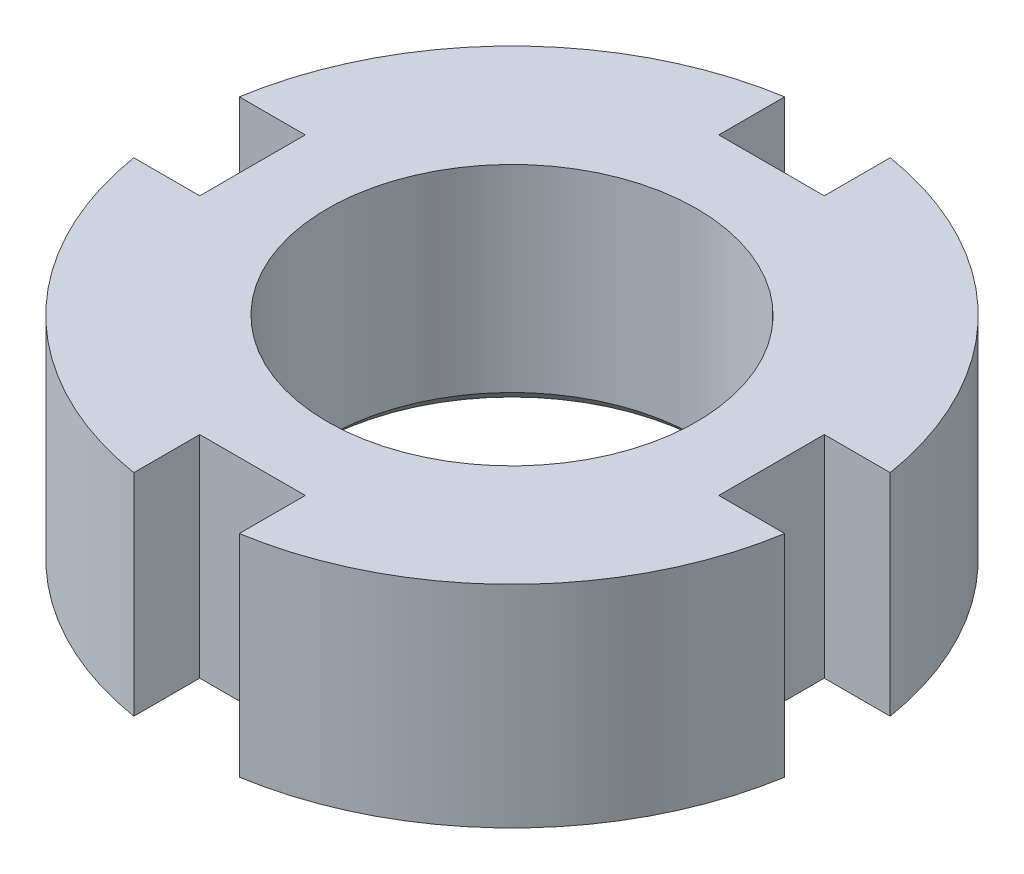
ISO-10303-21;
HEADER;
FILE_DESCRIPTION(('STEP AP214'),'2;1');
FILE_NAME('part.step','',(''),(''),'','','');
FILE_SCHEMA(('AUTOMOTIVE_DESIGN { 1 0 10303 214 1 1 1 1 }'));
ENDSEC;
DATA;
#1=APPLICATION_CONTEXT('core data for automotive mechanical design processes');
#2=APPLICATION_PROTOCOL_DEFINITION('international standard','automotive_design',2000,#1);
#3=PRODUCT_CONTEXT('',#1,'mechanical');
#4=PRODUCT('Part','Part','',(#3));
#5=PRODUCT_RELATED_PRODUCT_CATEGORY('part','',(#4));
#6=PRODUCT_DEFINITION_FORMATION('','',#4);
#7=PRODUCT_DEFINITION_CONTEXT('part definition',#1,'design');
#8=PRODUCT_DEFINITION('design','',#6,#7);
#9=PRODUCT_DEFINITION_SHAPE('','',#8);
#10=(LENGTH_UNIT() NAMED_UNIT(*) SI_UNIT(.MILLI.,.METRE.));
#11=(NAMED_UNIT(*) PLANE_ANGLE_UNIT() SI_UNIT($,.RADIAN.));
#12=(NAMED_UNIT(*) SI_UNIT($,.STERADIAN.) SOLID_ANGLE_UNIT());
#13=UNCERTAINTY_MEASURE_WITH_UNIT(LENGTH_MEASURE(1.E-05),#10,'distance_accuracy_value','');
#14=(GEOMETRIC_REPRESENTATION_CONTEXT(3) GLOBAL_UNCERTAINTY_ASSIGNED_CONTEXT((#13)) GLOBAL_UNIT_ASSIGNED_CONTEXT((#10,
#11,#12)) REPRESENTATION_CONTEXT('',''));
#15=CARTESIAN_POINT('',(0.,0.,0.));
#16=DIRECTION('',(0.,0.,1.));
#17=DIRECTION('',(1.,0.,0.));
#18=AXIS2_PLACEMENT_3D('',#15,#16,#17);
#19=CARTESIAN_POINT('',(19.6779253585061,8.,-4.));
#20=DIRECTION('',(-1.,0.,0.));
#21=DIRECTION('',(0.,0.,1.));
#22=AXIS2_PLACEMENT_3D('',#19,#20,#21);
#23=PLANE('',#22);
#24=DIRECTION('',(0.,0.,-1.));
#25=VECTOR('',#24,1.);
#26=CARTESIAN_POINT('',(19.6779253585061,-8.,-4.));
#27=LINE('',#26,#25);
#28=CARTESIAN_POINT('',(19.6779253585061,-8.,4.));
#29=VERTEX_POINT('',#28);
#30=CARTESIAN_POINT('',(19.6779253585061,-8.,-4.));
#31=VERTEX_POINT('',#30);
#32=EDGE_CURVE('E200',#29,#31,#27,.T.);
#33=ORIENTED_EDGE('',*,*,#32,.T.);
#34=DIRECTION('',(0.,-1.,0.));
#35=VECTOR('',#34,1.);
#36=CARTESIAN_POINT('',(19.6779253585061,8.,-4.));
#37=LINE('',#36,#35);
#38=CARTESIAN_POINT('',(19.6779253585061,8.,-4.));
#39=VERTEX_POINT('',#38);
#40=EDGE_CURVE('E11',#39,#31,#37,.T.);
#41=ORIENTED_EDGE('',*,*,#40,.F.);
#42=DIRECTION('',(0.,0.,-1.));
#43=VECTOR('',#42,1.);
#44=CARTESIAN_POINT('',(19.6779253585061,8.,-4.));
#45=LINE('',#44,#43);
#46=CARTESIAN_POINT('',(19.6779253585061,8.,4.));
#47=VERTEX_POINT('',#46);
#48=EDGE_CURVE('E247',#47,#39,#45,.T.);
#49=ORIENTED_EDGE('',*,*,#48,.F.);
#50=DIRECTION('',(0.,-1.,0.));
#51=VECTOR('',#50,1.);
#52=CARTESIAN_POINT('',(19.6779253585061,8.,4.));
#53=LINE('',#52,#51);
#54=EDGE_CURVE('E196',#47,#29,#53,.T.);
#55=ORIENTED_EDGE('',*,*,#54,.T.);
#56=EDGE_LOOP('',(#33,#41,#49,#55));
#57=FACE_BOUND('',#56,.T.);
#58=ADVANCED_FACE('F51',(#57),#23,.F.);
#59=CARTESIAN_POINT('',(19.6779253585061,8.,-4.));
#60=DIRECTION('',(0.,0.,-1.));
#61=DIRECTION('',(-1.,0.,0.));
#62=AXIS2_PLACEMENT_3D('',#59,#60,#61);
#63=PLANE('',#62);
#64=DIRECTION('',(1.,0.,0.));
#65=VECTOR('',#64,1.);
#66=CARTESIAN_POINT('',(19.6779253585061,-8.,-4.));
#67=LINE('',#66,#65);
#68=CARTESIAN_POINT('',(24.6779253585061,-8.,-4.));
#69=VERTEX_POINT('',#68);
#70=EDGE_CURVE('E204',#31,#69,#67,.T.);
#71=ORIENTED_EDGE('',*,*,#70,.T.);
#72=DIRECTION('',(0.,-1.,0.));
#73=VECTOR('',#72,1.);
#74=CARTESIAN_POINT('',(24.6779253585061,8.,-4.));
#75=LINE('',#74,#73);
#76=CARTESIAN_POINT('',(24.6779253585061,8.,-4.));
#77=VERTEX_POINT('',#76);
#78=EDGE_CURVE('E60',#77,#69,#75,.T.);
#79=ORIENTED_EDGE('',*,*,#78,.F.);
#80=DIRECTION('',(1.,0.,0.));
#81=VECTOR('',#80,1.);
#82=CARTESIAN_POINT('',(19.6779253585061,8.,-4.));
#83=LINE('',#82,#81);
#84=EDGE_CURVE('E135',#39,#77,#83,.T.);
#85=ORIENTED_EDGE('',*,*,#84,.F.);
#86=ORIENTED_EDGE('',*,*,#40,.T.);
#87=EDGE_LOOP('',(#71,#79,#85,#86));
#88=FACE_BOUND('',#87,.T.);
#89=ADVANCED_FACE('F370',(#88),#63,.F.);
#90=CARTESIAN_POINT('',(0.,8.,0.));
#91=DIRECTION('',(0.,-1.,0.));
#92=DIRECTION('',(0.,0.,-1.));
#93=AXIS2_PLACEMENT_3D('',#90,#91,#92);
#94=CYLINDRICAL_SURFACE('',#93,25.);
#95=CARTESIAN_POINT('',(0.,-8.,0.));
#96=DIRECTION('',(0.,1.,0.));
#97=DIRECTION('',(0.,0.,1.));
#98=AXIS2_PLACEMENT_3D('',#95,#96,#97);
#99=CIRCLE('',#98,25.);
#100=CARTESIAN_POINT('',(3.99999999999999,-8.,-24.6779253585061));
#101=VERTEX_POINT('',#100);
#102=EDGE_CURVE('E208',#69,#101,#99,.T.);
#103=ORIENTED_EDGE('',*,*,#102,.T.);
#104=DIRECTION('',(0.,-1.,0.));
#105=VECTOR('',#104,1.);
#106=CARTESIAN_POINT('',(3.99999999999999,8.,-24.6779253585061));
#107=LINE('',#106,#105);
#108=CARTESIAN_POINT('',(3.99999999999999,8.,-24.6779253585061));
#109=VERTEX_POINT('',#108);
#110=EDGE_CURVE('E290',#109,#101,#107,.T.);
#111=ORIENTED_EDGE('',*,*,#110,.F.);
#112=CARTESIAN_POINT('',(0.,8.,0.));
#113=DIRECTION('',(0.,1.,0.));
#114=DIRECTION('',(0.,0.,1.));
#115=AXIS2_PLACEMENT_3D('',#112,#113,#114);
#116=CIRCLE('',#115,25.);
#117=EDGE_CURVE('E300',#77,#109,#116,.T.);
#118=ORIENTED_EDGE('',*,*,#117,.F.);
#119=ORIENTED_EDGE('',*,*,#78,.T.);
#120=EDGE_LOOP('',(#103,#111,#118,#119));
#121=FACE_BOUND('',#120,.T.);
#122=ADVANCED_FACE('F298',(#121),#94,.T.);
#123=CARTESIAN_POINT('',(4.,8.,-19.6779253585061));
#124=DIRECTION('',(1.,0.,0.));
#125=DIRECTION('',(0.,0.,-1.));
#126=AXIS2_PLACEMENT_3D('',#123,#124,#125);
#127=PLANE('',#126);
#128=DIRECTION('',(0.,0.,1.));
#129=VECTOR('',#128,1.);
#130=CARTESIAN_POINT('',(4.,-8.,-19.6779253585061));
#131=LINE('',#130,#129);
#132=CARTESIAN_POINT('',(4.,-8.,-19.6779253585061));
#133=VERTEX_POINT('',#132);
#134=EDGE_CURVE('E211',#101,#133,#131,.T.);
#135=ORIENTED_EDGE('',*,*,#134,.T.);
#136=DIRECTION('',(0.,-1.,0.));
#137=VECTOR('',#136,1.);
#138=CARTESIAN_POINT('',(4.,8.,-19.6779253585061));
#139=LINE('',#138,#137);
#140=CARTESIAN_POINT('',(4.,8.,-19.6779253585061));
#141=VERTEX_POINT('',#140);
#142=EDGE_CURVE('E286',#141,#133,#139,.T.);
#143=ORIENTED_EDGE('',*,*,#142,.F.);
#144=DIRECTION('',(0.,0.,1.));
#145=VECTOR('',#144,1.);
#146=CARTESIAN_POINT('',(4.,8.,-19.6779253585061));
#147=LINE('',#146,#145);
#148=EDGE_CURVE('E319',#109,#141,#147,.T.);
#149=ORIENTED_EDGE('',*,*,#148,.F.);
#150=ORIENTED_EDGE('',*,*,#110,.T.);
#151=EDGE_LOOP('',(#135,#143,#149,#150));
#152=FACE_BOUND('',#151,.T.);
#153=ADVANCED_FACE('F309',(#152),#127,.F.);
#154=CARTESIAN_POINT('',(-4.,8.,-19.6779253585061));
#155=DIRECTION('',(0.,0.,1.));
#156=DIRECTION('',(1.,0.,0.));
#157=AXIS2_PLACEMENT_3D('',#154,#155,#156);
#158=PLANE('',#157);
#159=DIRECTION('',(-1.,0.,0.));
#160=VECTOR('',#159,1.);
#161=CARTESIAN_POINT('',(-4.,-8.,-19.6779253585061));
#162=LINE('',#161,#160);
#163=CARTESIAN_POINT('',(-4.,-8.,-19.6779253585061));
#164=VERTEX_POINT('',#163);
#165=EDGE_CURVE('E214',#133,#164,#162,.T.);
#166=ORIENTED_EDGE('',*,*,#165,.T.);
#167=DIRECTION('',(0.,-1.,0.));
#168=VECTOR('',#167,1.);
#169=CARTESIAN_POINT('',(-4.,8.,-19.6779253585061));
#170=LINE('',#169,#168);
#171=CARTESIAN_POINT('',(-4.,8.,-19.6779253585061));
#172=VERTEX_POINT('',#171);
#173=EDGE_CURVE('E282',#172,#164,#170,.T.);
#174=ORIENTED_EDGE('',*,*,#173,.F.);
#175=DIRECTION('',(-1.,0.,0.));
#176=VECTOR('',#175,1.);
#177=CARTESIAN_POINT('',(-4.,8.,-19.6779253585061));
#178=LINE('',#177,#176);
#179=EDGE_CURVE('E315',#141,#172,#178,.T.);
#180=ORIENTED_EDGE('',*,*,#179,.F.);
#181=ORIENTED_EDGE('',*,*,#142,.T.);
#182=EDGE_LOOP('',(#166,#174,#180,#181));
#183=FACE_BOUND('',#182,.T.);
#184=ADVANCED_FACE('F313',(#183),#158,.F.);
#185=CARTESIAN_POINT('',(-4.,8.,-19.6779253585061));
#186=DIRECTION('',(-1.,0.,0.));
#187=DIRECTION('',(0.,0.,1.));
#188=AXIS2_PLACEMENT_3D('',#185,#186,#187);
#189=PLANE('',#188);
#190=DIRECTION('',(0.,0.,-1.));
#191=VECTOR('',#190,1.);
#192=CARTESIAN_POINT('',(-4.,-8.,-19.6779253585061));
#193=LINE('',#192,#191);
#194=CARTESIAN_POINT('',(-4.,-8.,-24.6779253585061));
#195=VERTEX_POINT('',#194);
#196=EDGE_CURVE('E217',#164,#195,#193,.T.);
#197=ORIENTED_EDGE('',*,*,#196,.T.);
#198=DIRECTION('',(0.,-1.,0.));
#199=VECTOR('',#198,1.);
#200=CARTESIAN_POINT('',(-4.,8.,-24.6779253585061));
#201=LINE('',#200,#199);
#202=CARTESIAN_POINT('',(-4.,8.,-24.6779253585061));
#203=VERTEX_POINT('',#202);
#204=EDGE_CURVE('E278',#203,#195,#201,.T.);
#205=ORIENTED_EDGE('',*,*,#204,.F.);
#206=DIRECTION('',(0.,0.,-1.));
#207=VECTOR('',#206,1.);
#208=CARTESIAN_POINT('',(-4.,8.,-19.6779253585061));
#209=LINE('',#208,#207);
#210=EDGE_CURVE('E318',#172,#203,#209,.T.);
#211=ORIENTED_EDGE('',*,*,#210,.F.);
#212=ORIENTED_EDGE('',*,*,#173,.T.);
#213=EDGE_LOOP('',(#197,#205,#211,#212));
#214=FACE_BOUND('',#213,.T.);
#215=ADVANCED_FACE('F383',(#214),#189,.F.);
#216=CARTESIAN_POINT('',(0.,8.,0.));
#217=DIRECTION('',(0.,-1.,0.));
#218=DIRECTION('',(0.,0.,-1.));
#219=AXIS2_PLACEMENT_3D('',#216,#217,#218);
#220=CYLINDRICAL_SURFACE('',#219,25.);
#221=CARTESIAN_POINT('',(0.,-8.,0.));
#222=DIRECTION('',(0.,1.,0.));
#223=DIRECTION('',(0.,0.,1.));
#224=AXIS2_PLACEMENT_3D('',#221,#222,#223);
#225=CIRCLE('',#224,25.);
#226=CARTESIAN_POINT('',(-24.6779253585061,-8.,-3.99999999999999));
#227=VERTEX_POINT('',#226);
#228=EDGE_CURVE('E220',#195,#227,#225,.T.);
#229=ORIENTED_EDGE('',*,*,#228,.T.);
#230=DIRECTION('',(0.,-1.,0.));
#231=VECTOR('',#230,1.);
#232=CARTESIAN_POINT('',(-24.6779253585061,8.,-3.99999999999999));
#233=LINE('',#232,#231);
#234=CARTESIAN_POINT('',(-24.6779253585061,8.,-3.99999999999999));
#235=VERTEX_POINT('',#234);
#236=EDGE_CURVE('E274',#235,#227,#233,.T.);
#237=ORIENTED_EDGE('',*,*,#236,.F.);
#238=CARTESIAN_POINT('',(0.,8.,0.));
#239=DIRECTION('',(0.,1.,0.));
#240=DIRECTION('',(0.,0.,1.));
#241=AXIS2_PLACEMENT_3D('',#238,#239,#240);
#242=CIRCLE('',#241,25.);
#243=EDGE_CURVE('E323',#203,#235,#242,.T.);
#244=ORIENTED_EDGE('',*,*,#243,.F.);
#245=ORIENTED_EDGE('',*,*,#204,.T.);
#246=EDGE_LOOP('',(#229,#237,#244,#245));
#247=FACE_BOUND('',#246,.T.);
#248=ADVANCED_FACE('F386',(#247),#220,.T.);
#249=CARTESIAN_POINT('',(-19.6779253585061,8.,-4.));
#250=DIRECTION('',(0.,0.,-1.));
#251=DIRECTION('',(-1.,0.,0.));
#252=AXIS2_PLACEMENT_3D('',#249,#250,#251);
#253=PLANE('',#252);
#254=DIRECTION('',(1.,0.,0.));
#255=VECTOR('',#254,1.);
#256=CARTESIAN_POINT('',(-19.6779253585061,-8.,-4.));
#257=LINE('',#256,#255);
#258=CARTESIAN_POINT('',(-19.6779253585061,-8.,-4.));
#259=VERTEX_POINT('',#258);
#260=EDGE_CURVE('E223',#227,#259,#257,.T.);
#261=ORIENTED_EDGE('',*,*,#260,.T.);
#262=DIRECTION('',(0.,-1.,0.));
#263=VECTOR('',#262,1.);
#264=CARTESIAN_POINT('',(-19.6779253585061,8.,-4.));
#265=LINE('',#264,#263);
#266=CARTESIAN_POINT('',(-19.6779253585061,8.,-4.));
#267=VERTEX_POINT('',#266);
#268=EDGE_CURVE('E270',#267,#259,#265,.T.);
#269=ORIENTED_EDGE('',*,*,#268,.F.);
#270=DIRECTION('',(1.,0.,0.));
#271=VECTOR('',#270,1.);
#272=CARTESIAN_POINT('',(-19.6779253585061,8.,-4.));
#273=LINE('',#272,#271);
#274=EDGE_CURVE('E330',#235,#267,#273,.T.);
#275=ORIENTED_EDGE('',*,*,#274,.F.);
#276=ORIENTED_EDGE('',*,*,#236,.T.);
#277=EDGE_LOOP('',(#261,#269,#275,#276));
#278=FACE_BOUND('',#277,.T.);
#279=ADVANCED_FACE('F390',(#278),#253,.F.);
#280=CARTESIAN_POINT('',(-19.6779253585061,8.,4.));
#281=DIRECTION('',(1.,0.,0.));
#282=DIRECTION('',(0.,0.,-1.));
#283=AXIS2_PLACEMENT_3D('',#280,#281,#282);
#284=PLANE('',#283);
#285=DIRECTION('',(0.,0.,1.));
#286=VECTOR('',#285,1.);
#287=CARTESIAN_POINT('',(-19.6779253585061,-8.,4.));
#288=LINE('',#287,#286);
#289=CARTESIAN_POINT('',(-19.6779253585061,-8.,4.));
#290=VERTEX_POINT('',#289);
#291=EDGE_CURVE('E226',#259,#290,#288,.T.);
#292=ORIENTED_EDGE('',*,*,#291,.T.);
#293=DIRECTION('',(0.,-1.,0.));
#294=VECTOR('',#293,1.);
#295=CARTESIAN_POINT('',(-19.6779253585061,8.,4.));
#296=LINE('',#295,#294);
#297=CARTESIAN_POINT('',(-19.6779253585061,8.,4.));
#298=VERTEX_POINT('',#297);
#299=EDGE_CURVE('E266',#298,#290,#296,.T.);
#300=ORIENTED_EDGE('',*,*,#299,.F.);
#301=DIRECTION('',(0.,0.,1.));
#302=VECTOR('',#301,1.);
#303=CARTESIAN_POINT('',(-19.6779253585061,8.,4.));
#304=LINE('',#303,#302);
#305=EDGE_CURVE('E333',#267,#298,#304,.T.);
#306=ORIENTED_EDGE('',*,*,#305,.F.);
#307=ORIENTED_EDGE('',*,*,#268,.T.);
#308=EDGE_LOOP('',(#292,#300,#306,#307));
#309=FACE_BOUND('',#308,.T.);
#310=ADVANCED_FACE('F394',(#309),#284,.F.);
#311=CARTESIAN_POINT('',(-19.6779253585061,8.,4.));
#312=DIRECTION('',(0.,0.,1.));
#313=DIRECTION('',(1.,0.,0.));
#314=AXIS2_PLACEMENT_3D('',#311,#312,#313);
#315=PLANE('',#314);
#316=DIRECTION('',(-1.,0.,0.));
#317=VECTOR('',#316,1.);
#318=CARTESIAN_POINT('',(-19.6779253585061,-8.,4.));
#319=LINE('',#318,#317);
#320=CARTESIAN_POINT('',(-24.6779253585061,-8.,4.));
#321=VERTEX_POINT('',#320);
#322=EDGE_CURVE('E229',#290,#321,#319,.T.);
#323=ORIENTED_EDGE('',*,*,#322,.T.);
#324=DIRECTION('',(0.,-1.,0.));
#325=VECTOR('',#324,1.);
#326=CARTESIAN_POINT('',(-24.6779253585061,8.,4.));
#327=LINE('',#326,#325);
#328=CARTESIAN_POINT('',(-24.6779253585061,8.,4.));
#329=VERTEX_POINT('',#328);
#330=EDGE_CURVE('E262',#329,#321,#327,.T.);
#331=ORIENTED_EDGE('',*,*,#330,.F.);
#332=DIRECTION('',(-1.,0.,0.));
#333=VECTOR('',#332,1.);
#334=CARTESIAN_POINT('',(-19.6779253585061,8.,4.));
#335=LINE('',#334,#333);
#336=EDGE_CURVE('E336',#298,#329,#335,.T.);
#337=ORIENTED_EDGE('',*,*,#336,.F.);
#338=ORIENTED_EDGE('',*,*,#299,.T.);
#339=EDGE_LOOP('',(#323,#331,#337,#338));
#340=FACE_BOUND('',#339,.T.);
#341=ADVANCED_FACE('F398',(#340),#315,.F.);
#342=CARTESIAN_POINT('',(0.,8.,0.));
#343=DIRECTION('',(0.,-1.,0.));
#344=DIRECTION('',(0.,0.,-1.));
#345=AXIS2_PLACEMENT_3D('',#342,#343,#344);
#346=CYLINDRICAL_SURFACE('',#345,25.);
#347=CARTESIAN_POINT('',(0.,-8.,0.));
#348=DIRECTION('',(0.,1.,0.));
#349=DIRECTION('',(0.,0.,1.));
#350=AXIS2_PLACEMENT_3D('',#347,#348,#349);
#351=CIRCLE('',#350,25.);
#352=CARTESIAN_POINT('',(-3.99999999999999,-8.,24.6779253585061));
#353=VERTEX_POINT('',#352);
#354=EDGE_CURVE('E232',#321,#353,#351,.T.);
#355=ORIENTED_EDGE('',*,*,#354,.T.);
#356=DIRECTION('',(0.,-1.,0.));
#357=VECTOR('',#356,1.);
#358=CARTESIAN_POINT('',(-3.99999999999999,8.,24.6779253585061));
#359=LINE('',#358,#357);
#360=CARTESIAN_POINT('',(-3.99999999999999,8.,24.6779253585061));
#361=VERTEX_POINT('',#360);
#362=EDGE_CURVE('E258',#361,#353,#359,.T.);
#363=ORIENTED_EDGE('',*,*,#362,.F.);
#364=CARTESIAN_POINT('',(0.,8.,0.));
#365=DIRECTION('',(0.,1.,0.));
#366=DIRECTION('',(0.,0.,1.));
#367=AXIS2_PLACEMENT_3D('',#364,#365,#366);
#368=CIRCLE('',#367,25.);
#369=EDGE_CURVE('E339',#329,#361,#368,.T.);
#370=ORIENTED_EDGE('',*,*,#369,.F.);
#371=ORIENTED_EDGE('',*,*,#330,.T.);
#372=EDGE_LOOP('',(#355,#363,#370,#371));
#373=FACE_BOUND('',#372,.T.);
#374=ADVANCED_FACE('F402',(#373),#346,.T.);
#375=CARTESIAN_POINT('',(-4.,8.,19.6779253585061));
#376=DIRECTION('',(-1.,0.,0.));
#377=DIRECTION('',(0.,0.,1.));
#378=AXIS2_PLACEMENT_3D('',#375,#376,#377);
#379=PLANE('',#378);
#380=DIRECTION('',(0.,0.,-1.));
#381=VECTOR('',#380,1.);
#382=CARTESIAN_POINT('',(-4.,-8.,19.6779253585061));
#383=LINE('',#382,#381);
#384=CARTESIAN_POINT('',(-4.,-8.,19.6779253585061));
#385=VERTEX_POINT('',#384);
#386=EDGE_CURVE('E235',#353,#385,#383,.T.);
#387=ORIENTED_EDGE('',*,*,#386,.T.);
#388=DIRECTION('',(0.,-1.,0.));
#389=VECTOR('',#388,1.);
#390=CARTESIAN_POINT('',(-4.,8.,19.6779253585061));
#391=LINE('',#390,#389);
#392=CARTESIAN_POINT('',(-4.,8.,19.6779253585061));
#393=VERTEX_POINT('',#392);
#394=EDGE_CURVE('E254',#393,#385,#391,.T.);
#395=ORIENTED_EDGE('',*,*,#394,.F.);
#396=DIRECTION('',(0.,0.,-1.));
#397=VECTOR('',#396,1.);
#398=CARTESIAN_POINT('',(-4.,8.,19.6779253585061));
#399=LINE('',#398,#397);
#400=EDGE_CURVE('E342',#361,#393,#399,.T.);
#401=ORIENTED_EDGE('',*,*,#400,.F.);
#402=ORIENTED_EDGE('',*,*,#362,.T.);
#403=EDGE_LOOP('',(#387,#395,#401,#402));
#404=FACE_BOUND('',#403,.T.);
#405=ADVANCED_FACE('F350',(#404),#379,.F.);
#406=CARTESIAN_POINT('',(4.,8.,19.6779253585061));
#407=DIRECTION('',(0.,0.,-1.));
#408=DIRECTION('',(-1.,0.,0.));
#409=AXIS2_PLACEMENT_3D('',#406,#407,#408);
#410=PLANE('',#409);
#411=DIRECTION('',(1.,0.,0.));
#412=VECTOR('',#411,1.);
#413=CARTESIAN_POINT('',(4.,-8.,19.6779253585061));
#414=LINE('',#413,#412);
#415=CARTESIAN_POINT('',(4.,-8.,19.6779253585061));
#416=VERTEX_POINT('',#415);
#417=EDGE_CURVE('E238',#385,#416,#414,.T.);
#418=ORIENTED_EDGE('',*,*,#417,.T.);
#419=DIRECTION('',(0.,-1.,0.));
#420=VECTOR('',#419,1.);
#421=CARTESIAN_POINT('',(4.,8.,19.6779253585061));
#422=LINE('',#421,#420);
#423=CARTESIAN_POINT('',(4.,8.,19.6779253585061));
#424=VERTEX_POINT('',#423);
#425=EDGE_CURVE('E189',#424,#416,#422,.T.);
#426=ORIENTED_EDGE('',*,*,#425,.F.);
#427=DIRECTION('',(1.,0.,0.));
#428=VECTOR('',#427,1.);
#429=CARTESIAN_POINT('',(4.,8.,19.6779253585061));
#430=LINE('',#429,#428);
#431=EDGE_CURVE('E178',#393,#424,#430,.T.);
#432=ORIENTED_EDGE('',*,*,#431,.F.);
#433=ORIENTED_EDGE('',*,*,#394,.T.);
#434=EDGE_LOOP('',(#418,#426,#432,#433));
#435=FACE_BOUND('',#434,.T.);
#436=ADVANCED_FACE('F354',(#435),#410,.F.);
#437=CARTESIAN_POINT('',(4.,8.,19.6779253585061));
#438=DIRECTION('',(1.,0.,0.));
#439=DIRECTION('',(0.,0.,-1.));
#440=AXIS2_PLACEMENT_3D('',#437,#438,#439);
#441=PLANE('',#440);
#442=DIRECTION('',(0.,0.,1.));
#443=VECTOR('',#442,1.);
#444=CARTESIAN_POINT('',(4.,-8.,19.6779253585061));
#445=LINE('',#444,#443);
#446=CARTESIAN_POINT('',(4.,-8.,24.6779253585061));
#447=VERTEX_POINT('',#446);
#448=EDGE_CURVE('E187',#416,#447,#445,.T.);
#449=ORIENTED_EDGE('',*,*,#448,.T.);
#450=DIRECTION('',(0.,-1.,0.));
#451=VECTOR('',#450,1.);
#452=CARTESIAN_POINT('',(4.,8.,24.6779253585061));
#453=LINE('',#452,#451);
#454=CARTESIAN_POINT('',(4.,8.,24.6779253585061));
#455=VERTEX_POINT('',#454);
#456=EDGE_CURVE('E184',#455,#447,#453,.T.);
#457=ORIENTED_EDGE('',*,*,#456,.F.);
#458=DIRECTION('',(0.,0.,1.));
#459=VECTOR('',#458,1.);
#460=CARTESIAN_POINT('',(4.,8.,19.6779253585061));
#461=LINE('',#460,#459);
#462=EDGE_CURVE('E172',#424,#455,#461,.T.);
#463=ORIENTED_EDGE('',*,*,#462,.F.);
#464=ORIENTED_EDGE('',*,*,#425,.T.);
#465=EDGE_LOOP('',(#449,#457,#463,#464));
#466=FACE_BOUND('',#465,.T.);
#467=ADVANCED_FACE('F185',(#466),#441,.F.);
#468=CARTESIAN_POINT('',(0.,8.,0.));
#469=DIRECTION('',(0.,-1.,0.));
#470=DIRECTION('',(0.,0.,-1.));
#471=AXIS2_PLACEMENT_3D('',#468,#469,#470);
#472=CYLINDRICAL_SURFACE('',#471,25.);
#473=CARTESIAN_POINT('',(0.,-8.,0.));
#474=DIRECTION('',(0.,1.,0.));
#475=DIRECTION('',(0.,0.,1.));
#476=AXIS2_PLACEMENT_3D('',#473,#474,#475);
#477=CIRCLE('',#476,25.);
#478=CARTESIAN_POINT('',(24.6779253585061,-8.,4.));
#479=VERTEX_POINT('',#478);
#480=EDGE_CURVE('E121',#447,#479,#477,.T.);
#481=ORIENTED_EDGE('',*,*,#480,.T.);
#482=DIRECTION('',(0.,-1.,0.));
#483=VECTOR('',#482,1.);
#484=CARTESIAN_POINT('',(24.6779253585061,8.,4.));
#485=LINE('',#484,#483);
#486=CARTESIAN_POINT('',(24.6779253585061,8.,4.));
#487=VERTEX_POINT('',#486);
#488=EDGE_CURVE('E190',#487,#479,#485,.T.);
#489=ORIENTED_EDGE('',*,*,#488,.F.);
#490=CARTESIAN_POINT('',(0.,8.,0.));
#491=DIRECTION('',(0.,1.,0.));
#492=DIRECTION('',(0.,0.,1.));
#493=AXIS2_PLACEMENT_3D('',#490,#491,#492);
#494=CIRCLE('',#493,25.);
#495=EDGE_CURVE('E176',#455,#487,#494,.T.);
#496=ORIENTED_EDGE('',*,*,#495,.F.);
#497=ORIENTED_EDGE('',*,*,#456,.T.);
#498=EDGE_LOOP('',(#481,#489,#496,#497));
#499=FACE_BOUND('',#498,.T.);
#500=ADVANCED_FACE('F192',(#499),#472,.T.);
#501=CARTESIAN_POINT('',(19.6779253585061,8.,4.));
#502=DIRECTION('',(0.,0.,1.));
#503=DIRECTION('',(1.,0.,0.));
#504=AXIS2_PLACEMENT_3D('',#501,#502,#503);
#505=PLANE('',#504);
#506=DIRECTION('',(-1.,0.,0.));
#507=VECTOR('',#506,1.);
#508=CARTESIAN_POINT('',(19.6779253585061,-8.,4.));
#509=LINE('',#508,#507);
#510=EDGE_CURVE('E127',#479,#29,#509,.T.);
#511=ORIENTED_EDGE('',*,*,#510,.T.);
#512=ORIENTED_EDGE('',*,*,#54,.F.);
#513=DIRECTION('',(-1.,0.,0.));
#514=VECTOR('',#513,1.);
#515=CARTESIAN_POINT('',(19.6779253585061,8.,4.));
#516=LINE('',#515,#514);
#517=EDGE_CURVE('E68',#487,#47,#516,.T.);
#518=ORIENTED_EDGE('',*,*,#517,.F.);
#519=ORIENTED_EDGE('',*,*,#488,.T.);
#520=EDGE_LOOP('',(#511,#512,#518,#519));
#521=FACE_BOUND('',#520,.T.);
#522=ADVANCED_FACE('F358',(#521),#505,.F.);
#523=CARTESIAN_POINT('',(0.,8.,0.));
#524=DIRECTION('',(0.,1.,0.));
#525=DIRECTION('',(0.,0.,1.));
#526=AXIS2_PLACEMENT_3D('',#523,#524,#525);
#527=PLANE('',#526);
#528=CARTESIAN_POINT('',(0.,7.99999999999999,0.));
#529=DIRECTION('',(0.,-1.,0.));
#530=DIRECTION('',(0.,0.,-1.));
#531=AXIS2_PLACEMENT_3D('',#528,#529,#530);
#532=CIRCLE('',#531,14.);
#533=CARTESIAN_POINT('',(0.,7.99999999999999,-14.));
#534=VERTEX_POINT('',#533);
#535=EDGE_CURVE('E205',#534,#534,#532,.T.);
#536=ORIENTED_EDGE('',*,*,#535,.T.);
#537=EDGE_LOOP('',(#536));
#538=FACE_BOUND('',#537,.T.);
#539=ORIENTED_EDGE('',*,*,#48,.T.);
#540=ORIENTED_EDGE('',*,*,#84,.T.);
#541=ORIENTED_EDGE('',*,*,#117,.T.);
#542=ORIENTED_EDGE('',*,*,#148,.T.);
#543=ORIENTED_EDGE('',*,*,#179,.T.);
#544=ORIENTED_EDGE('',*,*,#210,.T.);
#545=ORIENTED_EDGE('',*,*,#243,.T.);
#546=ORIENTED_EDGE('',*,*,#274,.T.);
#547=ORIENTED_EDGE('',*,*,#305,.T.);
#548=ORIENTED_EDGE('',*,*,#336,.T.);
#549=ORIENTED_EDGE('',*,*,#369,.T.);
#550=ORIENTED_EDGE('',*,*,#400,.T.);
#551=ORIENTED_EDGE('',*,*,#431,.T.);
#552=ORIENTED_EDGE('',*,*,#462,.T.);
#553=ORIENTED_EDGE('',*,*,#495,.T.);
#554=ORIENTED_EDGE('',*,*,#517,.T.);
#555=EDGE_LOOP('',(#539,#540,#541,#542,#543,#544,#545,#546,#547,#548,#549,#550,#551,#552,#553,#554));
#556=FACE_BOUND('',#555,.T.);
#557=ADVANCED_FACE('F174',(#538,#556),#527,.T.);
#558=CARTESIAN_POINT('',(0.,-8.,0.));
#559=DIRECTION('',(0.,1.,0.));
#560=DIRECTION('',(0.,0.,1.));
#561=AXIS2_PLACEMENT_3D('',#558,#559,#560);
#562=PLANE('',#561);
#563=CARTESIAN_POINT('',(0.,-8.,0.));
#564=DIRECTION('',(0.,-1.,0.));
#565=DIRECTION('',(0.,0.,-1.));
#566=AXIS2_PLACEMENT_3D('',#563,#564,#565);
#567=CIRCLE('',#566,15.025);
#568=CARTESIAN_POINT('',(0.,-8.,-15.025));
#569=VERTEX_POINT('',#568);
#570=EDGE_CURVE('E479',#569,#569,#567,.T.);
#571=ORIENTED_EDGE('',*,*,#570,.F.);
#572=EDGE_LOOP('',(#571));
#573=FACE_BOUND('',#572,.T.);
#574=ORIENTED_EDGE('',*,*,#32,.F.);
#575=ORIENTED_EDGE('',*,*,#510,.F.);
#576=ORIENTED_EDGE('',*,*,#480,.F.);
#577=ORIENTED_EDGE('',*,*,#448,.F.);
#578=ORIENTED_EDGE('',*,*,#417,.F.);
#579=ORIENTED_EDGE('',*,*,#386,.F.);
#580=ORIENTED_EDGE('',*,*,#354,.F.);
#581=ORIENTED_EDGE('',*,*,#322,.F.);
#582=ORIENTED_EDGE('',*,*,#291,.F.);
#583=ORIENTED_EDGE('',*,*,#260,.F.);
#584=ORIENTED_EDGE('',*,*,#228,.F.);
#585=ORIENTED_EDGE('',*,*,#196,.F.);
#586=ORIENTED_EDGE('',*,*,#165,.F.);
#587=ORIENTED_EDGE('',*,*,#134,.F.);
#588=ORIENTED_EDGE('',*,*,#102,.F.);
#589=ORIENTED_EDGE('',*,*,#70,.F.);
#590=EDGE_LOOP('',(#574,#575,#576,#577,#578,#579,#580,#581,#582,#583,#584,#585,#586,#587,#588,#589));
#591=FACE_BOUND('',#590,.T.);
#592=ADVANCED_FACE('F304',(#573,#591),#562,.F.);
#593=CARTESIAN_POINT('',(0.,-8.,0.));
#594=DIRECTION('',(0.,-1.,0.));
#595=DIRECTION('',(0.,0.,-1.));
#596=AXIS2_PLACEMENT_3D('',#593,#594,#595);
#597=CYLINDRICAL_SURFACE('',#596,14.);
#598=ORIENTED_EDGE('',*,*,#535,.F.);
#599=EDGE_LOOP('',(#598));
#600=FACE_BOUND('',#599,.T.);
#601=CARTESIAN_POINT('',(0.,-6.97499999999999,0.));
#602=DIRECTION('',(0.,-1.,0.));
#603=DIRECTION('',(0.,0.,-1.));
#604=AXIS2_PLACEMENT_3D('',#601,#602,#603);
#605=CIRCLE('',#604,14.);
#606=CARTESIAN_POINT('',(0.,-6.97499999999999,-14.));
#607=VERTEX_POINT('',#606);
#608=EDGE_CURVE('E476',#607,#607,#605,.T.);
#609=ORIENTED_EDGE('',*,*,#608,.T.);
#610=EDGE_LOOP('',(#609));
#611=FACE_BOUND('',#610,.T.);
#612=ADVANCED_FACE('F442',(#600,#611),#597,.F.);
#613=CARTESIAN_POINT('',(0.,-8.,0.));
#614=DIRECTION('',(0.,-1.,0.));
#615=DIRECTION('',(0.,0.,-1.));
#616=AXIS2_PLACEMENT_3D('',#613,#614,#615);
#617=CONICAL_SURFACE('',#616,15.025,0.785398163397447);
#618=ORIENTED_EDGE('',*,*,#608,.F.);
#619=EDGE_LOOP('',(#618));
#620=FACE_BOUND('',#619,.T.);
#621=ORIENTED_EDGE('',*,*,#570,.T.);
#622=EDGE_LOOP('',(#621));
#623=FACE_BOUND('',#622,.T.);
#624=ADVANCED_FACE('F452',(#620,#623),#617,.F.);
#625=CLOSED_SHELL('',(#58,#89,#122,#153,#184,#215,#248,#279,#310,#341,#374,#405,#436,#467,#500,
#522,#557,#592,#612,#624));
#626=MANIFOLD_SOLID_BREP('B2',#625);
#627=ADVANCED_BREP_SHAPE_REPRESENTATION('',(#18,#626),#14);
#628=SHAPE_DEFINITION_REPRESENTATION(#9,#627);
ENDSEC;
END-ISO-10303-21;
